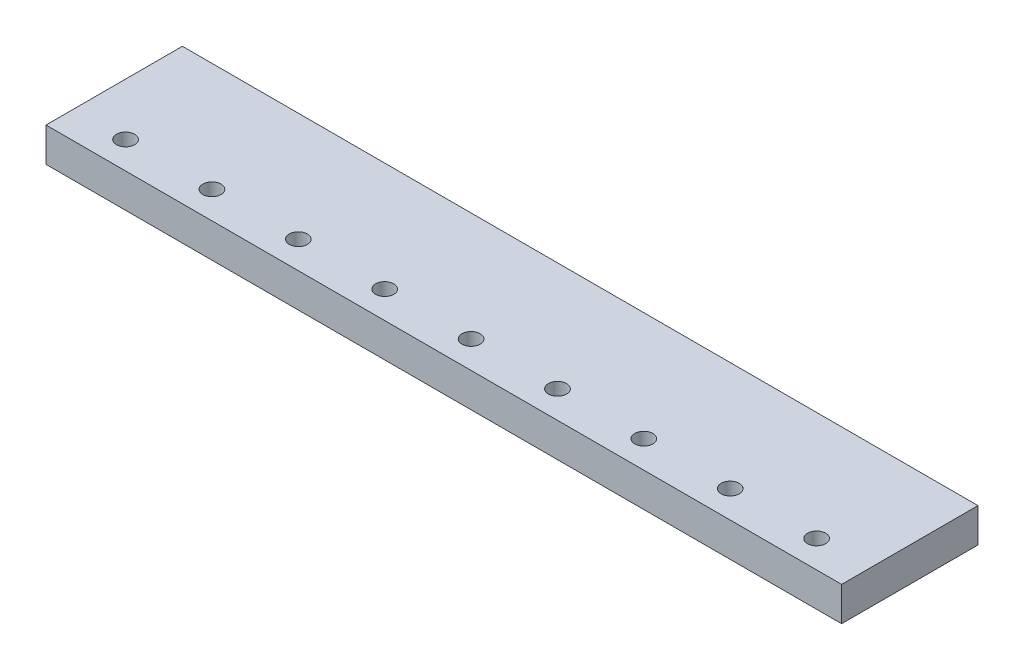
ISO-10303-21;
HEADER;
FILE_DESCRIPTION(('STEP AP214'),'2;1');
FILE_NAME('part.step','',(''),(''),'','','');
FILE_SCHEMA(('AUTOMOTIVE_DESIGN { 1 0 10303 214 1 1 1 1 }'));
ENDSEC;
DATA;
#1=APPLICATION_CONTEXT('core data for automotive mechanical design processes');
#2=APPLICATION_PROTOCOL_DEFINITION('international standard','automotive_design',2000,#1);
#3=PRODUCT_CONTEXT('',#1,'mechanical');
#4=PRODUCT('Part','Part','',(#3));
#5=PRODUCT_RELATED_PRODUCT_CATEGORY('part','',(#4));
#6=PRODUCT_DEFINITION_FORMATION('','',#4);
#7=PRODUCT_DEFINITION_CONTEXT('part definition',#1,'design');
#8=PRODUCT_DEFINITION('design','',#6,#7);
#9=PRODUCT_DEFINITION_SHAPE('','',#8);
#10=(LENGTH_UNIT() NAMED_UNIT(*) SI_UNIT(.MILLI.,.METRE.));
#11=(NAMED_UNIT(*) PLANE_ANGLE_UNIT() SI_UNIT($,.RADIAN.));
#12=(NAMED_UNIT(*) SI_UNIT($,.STERADIAN.) SOLID_ANGLE_UNIT());
#13=UNCERTAINTY_MEASURE_WITH_UNIT(LENGTH_MEASURE(1.E-05),#10,'distance_accuracy_value','');
#14=(GEOMETRIC_REPRESENTATION_CONTEXT(3) GLOBAL_UNCERTAINTY_ASSIGNED_CONTEXT((#13)) GLOBAL_UNIT_ASSIGNED_CONTEXT((#10,
#11,#12)) REPRESENTATION_CONTEXT('',''));
#15=CARTESIAN_POINT('',(0.,0.,0.));
#16=DIRECTION('',(0.,0.,1.));
#17=DIRECTION('',(1.,0.,0.));
#18=AXIS2_PLACEMENT_3D('',#15,#16,#17);
#19=CARTESIAN_POINT('',(0.,15.,0.));
#20=DIRECTION('',(1.,0.,0.));
#21=DIRECTION('',(0.,0.,-1.));
#22=AXIS2_PLACEMENT_3D('',#19,#20,#21);
#23=PLANE('',#22);
#24=DIRECTION('',(0.,0.,1.));
#25=VECTOR('',#24,1.);
#26=CARTESIAN_POINT('',(0.,0.,0.));
#27=LINE('',#26,#25);
#28=CARTESIAN_POINT('',(0.,0.,0.));
#29=VERTEX_POINT('',#28);
#30=CARTESIAN_POINT('',(0.,0.,60.));
#31=VERTEX_POINT('',#30);
#32=EDGE_CURVE('E110',#29,#31,#27,.T.);
#33=ORIENTED_EDGE('',*,*,#32,.T.);
#34=DIRECTION('',(0.,-1.,0.));
#35=VECTOR('',#34,1.);
#36=CARTESIAN_POINT('',(0.,15.,60.));
#37=LINE('',#36,#35);
#38=CARTESIAN_POINT('',(0.,15.,60.));
#39=VERTEX_POINT('',#38);
#40=EDGE_CURVE('E11',#39,#31,#37,.T.);
#41=ORIENTED_EDGE('',*,*,#40,.F.);
#42=DIRECTION('',(0.,0.,1.));
#43=VECTOR('',#42,1.);
#44=CARTESIAN_POINT('',(0.,15.,0.));
#45=LINE('',#44,#43);
#46=CARTESIAN_POINT('',(0.,15.,0.));
#47=VERTEX_POINT('',#46);
#48=EDGE_CURVE('E94',#47,#39,#45,.T.);
#49=ORIENTED_EDGE('',*,*,#48,.F.);
#50=DIRECTION('',(0.,-1.,0.));
#51=VECTOR('',#50,1.);
#52=CARTESIAN_POINT('',(0.,15.,0.));
#53=LINE('',#52,#51);
#54=EDGE_CURVE('E106',#47,#29,#53,.T.);
#55=ORIENTED_EDGE('',*,*,#54,.T.);
#56=EDGE_LOOP('',(#33,#41,#49,#55));
#57=FACE_BOUND('',#56,.T.);
#58=ADVANCED_FACE('F42',(#57),#23,.F.);
#59=CARTESIAN_POINT('',(0.,15.,60.));
#60=DIRECTION('',(0.,0.,-1.));
#61=DIRECTION('',(-1.,0.,0.));
#62=AXIS2_PLACEMENT_3D('',#59,#60,#61);
#63=PLANE('',#62);
#64=DIRECTION('',(1.,0.,0.));
#65=VECTOR('',#64,1.);
#66=CARTESIAN_POINT('',(0.,0.,60.));
#67=LINE('',#66,#65);
#68=CARTESIAN_POINT('',(350.,0.,60.));
#69=VERTEX_POINT('',#68);
#70=EDGE_CURVE('E99',#31,#69,#67,.T.);
#71=ORIENTED_EDGE('',*,*,#70,.T.);
#72=DIRECTION('',(0.,-1.,0.));
#73=VECTOR('',#72,1.);
#74=CARTESIAN_POINT('',(350.,15.,60.));
#75=LINE('',#74,#73);
#76=CARTESIAN_POINT('',(350.,15.,60.));
#77=VERTEX_POINT('',#76);
#78=EDGE_CURVE('E51',#77,#69,#75,.T.);
#79=ORIENTED_EDGE('',*,*,#78,.F.);
#80=DIRECTION('',(1.,0.,0.));
#81=VECTOR('',#80,1.);
#82=CARTESIAN_POINT('',(0.,15.,60.));
#83=LINE('',#82,#81);
#84=EDGE_CURVE('E89',#39,#77,#83,.T.);
#85=ORIENTED_EDGE('',*,*,#84,.F.);
#86=ORIENTED_EDGE('',*,*,#40,.T.);
#87=EDGE_LOOP('',(#71,#79,#85,#86));
#88=FACE_BOUND('',#87,.T.);
#89=ADVANCED_FACE('F98',(#88),#63,.F.);
#90=CARTESIAN_POINT('',(350.,15.,0.));
#91=DIRECTION('',(-1.,0.,0.));
#92=DIRECTION('',(0.,0.,1.));
#93=AXIS2_PLACEMENT_3D('',#90,#91,#92);
#94=PLANE('',#93);
#95=DIRECTION('',(0.,0.,-1.));
#96=VECTOR('',#95,1.);
#97=CARTESIAN_POINT('',(350.,0.,0.));
#98=LINE('',#97,#96);
#99=CARTESIAN_POINT('',(350.,0.,0.));
#100=VERTEX_POINT('',#99);
#101=EDGE_CURVE('E76',#69,#100,#98,.T.);
#102=ORIENTED_EDGE('',*,*,#101,.T.);
#103=DIRECTION('',(0.,-1.,0.));
#104=VECTOR('',#103,1.);
#105=CARTESIAN_POINT('',(350.,15.,0.));
#106=LINE('',#105,#104);
#107=CARTESIAN_POINT('',(350.,15.,0.));
#108=VERTEX_POINT('',#107);
#109=EDGE_CURVE('E101',#108,#100,#106,.T.);
#110=ORIENTED_EDGE('',*,*,#109,.F.);
#111=DIRECTION('',(0.,0.,-1.));
#112=VECTOR('',#111,1.);
#113=CARTESIAN_POINT('',(350.,15.,0.));
#114=LINE('',#113,#112);
#115=EDGE_CURVE('E92',#77,#108,#114,.T.);
#116=ORIENTED_EDGE('',*,*,#115,.F.);
#117=ORIENTED_EDGE('',*,*,#78,.T.);
#118=EDGE_LOOP('',(#102,#110,#116,#117));
#119=FACE_BOUND('',#118,.T.);
#120=ADVANCED_FACE('F102',(#119),#94,.F.);
#121=CARTESIAN_POINT('',(0.,15.,0.));
#122=DIRECTION('',(0.,0.,1.));
#123=DIRECTION('',(1.,0.,0.));
#124=AXIS2_PLACEMENT_3D('',#121,#122,#123);
#125=PLANE('',#124);
#126=DIRECTION('',(-1.,0.,0.));
#127=VECTOR('',#126,1.);
#128=CARTESIAN_POINT('',(0.,0.,0.));
#129=LINE('',#128,#127);
#130=EDGE_CURVE('E82',#100,#29,#129,.T.);
#131=ORIENTED_EDGE('',*,*,#130,.T.);
#132=ORIENTED_EDGE('',*,*,#54,.F.);
#133=DIRECTION('',(-1.,0.,0.));
#134=VECTOR('',#133,1.);
#135=CARTESIAN_POINT('',(0.,15.,0.));
#136=LINE('',#135,#134);
#137=EDGE_CURVE('E59',#108,#47,#136,.T.);
#138=ORIENTED_EDGE('',*,*,#137,.F.);
#139=ORIENTED_EDGE('',*,*,#109,.T.);
#140=EDGE_LOOP('',(#131,#132,#138,#139));
#141=FACE_BOUND('',#140,.T.);
#142=ADVANCED_FACE('F124',(#141),#125,.F.);
#143=CARTESIAN_POINT('',(0.,15.,0.));
#144=DIRECTION('',(0.,1.,0.));
#145=DIRECTION('',(0.,0.,1.));
#146=AXIS2_PLACEMENT_3D('',#143,#144,#145);
#147=PLANE('',#146);
#148=CARTESIAN_POINT('',(23.,15.,48.));
#149=DIRECTION('',(0.,1.,0.));
#150=DIRECTION('',(0.,0.,1.));
#151=AXIS2_PLACEMENT_3D('',#148,#149,#150);
#152=CIRCLE('',#151,4.);
#153=CARTESIAN_POINT('',(23.,15.,52.));
#154=VERTEX_POINT('',#153);
#155=EDGE_CURVE('E195',#154,#154,#152,.T.);
#156=ORIENTED_EDGE('',*,*,#155,.F.);
#157=EDGE_LOOP('',(#156));
#158=FACE_BOUND('',#157,.T.);
#159=CARTESIAN_POINT('',(61.,15.,48.));
#160=DIRECTION('',(0.,1.,0.));
#161=DIRECTION('',(0.,0.,1.));
#162=AXIS2_PLACEMENT_3D('',#159,#160,#161);
#163=CIRCLE('',#162,3.99999999999999);
#164=CARTESIAN_POINT('',(61.,15.,52.));
#165=VERTEX_POINT('',#164);
#166=EDGE_CURVE('E191',#165,#165,#163,.T.);
#167=ORIENTED_EDGE('',*,*,#166,.F.);
#168=EDGE_LOOP('',(#167));
#169=FACE_BOUND('',#168,.T.);
#170=CARTESIAN_POINT('',(99.,15.,48.));
#171=DIRECTION('',(0.,1.,0.));
#172=DIRECTION('',(0.,0.,1.));
#173=AXIS2_PLACEMENT_3D('',#170,#171,#172);
#174=CIRCLE('',#173,3.99999999999999);
#175=CARTESIAN_POINT('',(99.,15.,52.));
#176=VERTEX_POINT('',#175);
#177=EDGE_CURVE('E183',#176,#176,#174,.T.);
#178=ORIENTED_EDGE('',*,*,#177,.F.);
#179=EDGE_LOOP('',(#178));
#180=FACE_BOUND('',#179,.T.);
#181=CARTESIAN_POINT('',(137.,15.,48.));
#182=DIRECTION('',(0.,1.,0.));
#183=DIRECTION('',(0.,0.,1.));
#184=AXIS2_PLACEMENT_3D('',#181,#182,#183);
#185=CIRCLE('',#184,4.00000000000002);
#186=CARTESIAN_POINT('',(137.,15.,52.));
#187=VERTEX_POINT('',#186);
#188=EDGE_CURVE('E175',#187,#187,#185,.T.);
#189=ORIENTED_EDGE('',*,*,#188,.F.);
#190=EDGE_LOOP('',(#189));
#191=FACE_BOUND('',#190,.T.);
#192=CARTESIAN_POINT('',(175.,15.,48.));
#193=DIRECTION('',(0.,1.,0.));
#194=DIRECTION('',(0.,0.,1.));
#195=AXIS2_PLACEMENT_3D('',#192,#193,#194);
#196=CIRCLE('',#195,3.99999999999999);
#197=CARTESIAN_POINT('',(175.,15.,52.));
#198=VERTEX_POINT('',#197);
#199=EDGE_CURVE('E167',#198,#198,#196,.T.);
#200=ORIENTED_EDGE('',*,*,#199,.F.);
#201=EDGE_LOOP('',(#200));
#202=FACE_BOUND('',#201,.T.);
#203=CARTESIAN_POINT('',(213.,15.,48.));
#204=DIRECTION('',(0.,1.,0.));
#205=DIRECTION('',(0.,0.,1.));
#206=AXIS2_PLACEMENT_3D('',#203,#204,#205);
#207=CIRCLE('',#206,4.00000000000002);
#208=CARTESIAN_POINT('',(213.,15.,52.));
#209=VERTEX_POINT('',#208);
#210=EDGE_CURVE('E159',#209,#209,#207,.T.);
#211=ORIENTED_EDGE('',*,*,#210,.F.);
#212=EDGE_LOOP('',(#211));
#213=FACE_BOUND('',#212,.T.);
#214=CARTESIAN_POINT('',(251.,15.,48.));
#215=DIRECTION('',(0.,1.,0.));
#216=DIRECTION('',(0.,0.,1.));
#217=AXIS2_PLACEMENT_3D('',#214,#215,#216);
#218=CIRCLE('',#217,3.99999999999999);
#219=CARTESIAN_POINT('',(251.,15.,52.));
#220=VERTEX_POINT('',#219);
#221=EDGE_CURVE('E151',#220,#220,#218,.T.);
#222=ORIENTED_EDGE('',*,*,#221,.F.);
#223=EDGE_LOOP('',(#222));
#224=FACE_BOUND('',#223,.T.);
#225=CARTESIAN_POINT('',(289.,15.,48.));
#226=DIRECTION('',(0.,1.,0.));
#227=DIRECTION('',(0.,0.,1.));
#228=AXIS2_PLACEMENT_3D('',#225,#226,#227);
#229=CIRCLE('',#228,3.99999999999999);
#230=CARTESIAN_POINT('',(289.,15.,52.));
#231=VERTEX_POINT('',#230);
#232=EDGE_CURVE('E143',#231,#231,#229,.T.);
#233=ORIENTED_EDGE('',*,*,#232,.F.);
#234=EDGE_LOOP('',(#233));
#235=FACE_BOUND('',#234,.T.);
#236=CARTESIAN_POINT('',(327.,15.,48.));
#237=DIRECTION('',(0.,1.,0.));
#238=DIRECTION('',(0.,0.,1.));
#239=AXIS2_PLACEMENT_3D('',#236,#237,#238);
#240=CIRCLE('',#239,3.99999999999999);
#241=CARTESIAN_POINT('',(327.,15.,52.));
#242=VERTEX_POINT('',#241);
#243=EDGE_CURVE('E135',#242,#242,#240,.T.);
#244=ORIENTED_EDGE('',*,*,#243,.F.);
#245=EDGE_LOOP('',(#244));
#246=FACE_BOUND('',#245,.T.);
#247=ORIENTED_EDGE('',*,*,#48,.T.);
#248=ORIENTED_EDGE('',*,*,#84,.T.);
#249=ORIENTED_EDGE('',*,*,#115,.T.);
#250=ORIENTED_EDGE('',*,*,#137,.T.);
#251=EDGE_LOOP('',(#247,#248,#249,#250));
#252=FACE_BOUND('',#251,.T.);
#253=ADVANCED_FACE('F90',(#158,#169,#180,#191,#202,#213,#224,#235,#246,#252),#147,.T.);
#254=CARTESIAN_POINT('',(0.,0.,0.));
#255=DIRECTION('',(0.,1.,0.));
#256=DIRECTION('',(0.,0.,1.));
#257=AXIS2_PLACEMENT_3D('',#254,#255,#256);
#258=PLANE('',#257);
#259=CARTESIAN_POINT('',(23.,0.,48.));
#260=DIRECTION('',(0.,1.,0.));
#261=DIRECTION('',(0.,0.,1.));
#262=AXIS2_PLACEMENT_3D('',#259,#260,#261);
#263=CIRCLE('',#262,4.);
#264=CARTESIAN_POINT('',(23.,0.,52.));
#265=VERTEX_POINT('',#264);
#266=EDGE_CURVE('E114',#265,#265,#263,.T.);
#267=ORIENTED_EDGE('',*,*,#266,.T.);
#268=EDGE_LOOP('',(#267));
#269=FACE_BOUND('',#268,.T.);
#270=CARTESIAN_POINT('',(61.,0.,48.));
#271=DIRECTION('',(0.,1.,0.));
#272=DIRECTION('',(0.,0.,1.));
#273=AXIS2_PLACEMENT_3D('',#270,#271,#272);
#274=CIRCLE('',#273,3.99999999999999);
#275=CARTESIAN_POINT('',(61.,0.,52.));
#276=VERTEX_POINT('',#275);
#277=EDGE_CURVE('E187',#276,#276,#274,.T.);
#278=ORIENTED_EDGE('',*,*,#277,.T.);
#279=EDGE_LOOP('',(#278));
#280=FACE_BOUND('',#279,.T.);
#281=CARTESIAN_POINT('',(99.,0.,48.));
#282=DIRECTION('',(0.,1.,0.));
#283=DIRECTION('',(0.,0.,1.));
#284=AXIS2_PLACEMENT_3D('',#281,#282,#283);
#285=CIRCLE('',#284,3.99999999999999);
#286=CARTESIAN_POINT('',(99.,0.,52.));
#287=VERTEX_POINT('',#286);
#288=EDGE_CURVE('E179',#287,#287,#285,.T.);
#289=ORIENTED_EDGE('',*,*,#288,.T.);
#290=EDGE_LOOP('',(#289));
#291=FACE_BOUND('',#290,.T.);
#292=CARTESIAN_POINT('',(137.,0.,48.));
#293=DIRECTION('',(0.,1.,0.));
#294=DIRECTION('',(0.,0.,1.));
#295=AXIS2_PLACEMENT_3D('',#292,#293,#294);
#296=CIRCLE('',#295,4.00000000000002);
#297=CARTESIAN_POINT('',(137.,0.,52.));
#298=VERTEX_POINT('',#297);
#299=EDGE_CURVE('E171',#298,#298,#296,.T.);
#300=ORIENTED_EDGE('',*,*,#299,.T.);
#301=EDGE_LOOP('',(#300));
#302=FACE_BOUND('',#301,.T.);
#303=CARTESIAN_POINT('',(175.,0.,48.));
#304=DIRECTION('',(0.,1.,0.));
#305=DIRECTION('',(0.,0.,1.));
#306=AXIS2_PLACEMENT_3D('',#303,#304,#305);
#307=CIRCLE('',#306,3.99999999999999);
#308=CARTESIAN_POINT('',(175.,0.,52.));
#309=VERTEX_POINT('',#308);
#310=EDGE_CURVE('E163',#309,#309,#307,.T.);
#311=ORIENTED_EDGE('',*,*,#310,.T.);
#312=EDGE_LOOP('',(#311));
#313=FACE_BOUND('',#312,.T.);
#314=CARTESIAN_POINT('',(213.,0.,48.));
#315=DIRECTION('',(0.,1.,0.));
#316=DIRECTION('',(0.,0.,1.));
#317=AXIS2_PLACEMENT_3D('',#314,#315,#316);
#318=CIRCLE('',#317,4.00000000000002);
#319=CARTESIAN_POINT('',(213.,0.,52.));
#320=VERTEX_POINT('',#319);
#321=EDGE_CURVE('E155',#320,#320,#318,.T.);
#322=ORIENTED_EDGE('',*,*,#321,.T.);
#323=EDGE_LOOP('',(#322));
#324=FACE_BOUND('',#323,.T.);
#325=CARTESIAN_POINT('',(251.,0.,48.));
#326=DIRECTION('',(0.,1.,0.));
#327=DIRECTION('',(0.,0.,1.));
#328=AXIS2_PLACEMENT_3D('',#325,#326,#327);
#329=CIRCLE('',#328,3.99999999999999);
#330=CARTESIAN_POINT('',(251.,0.,52.));
#331=VERTEX_POINT('',#330);
#332=EDGE_CURVE('E147',#331,#331,#329,.T.);
#333=ORIENTED_EDGE('',*,*,#332,.T.);
#334=EDGE_LOOP('',(#333));
#335=FACE_BOUND('',#334,.T.);
#336=CARTESIAN_POINT('',(289.,0.,48.));
#337=DIRECTION('',(0.,1.,0.));
#338=DIRECTION('',(0.,0.,1.));
#339=AXIS2_PLACEMENT_3D('',#336,#337,#338);
#340=CIRCLE('',#339,3.99999999999999);
#341=CARTESIAN_POINT('',(289.,0.,52.));
#342=VERTEX_POINT('',#341);
#343=EDGE_CURVE('E139',#342,#342,#340,.T.);
#344=ORIENTED_EDGE('',*,*,#343,.T.);
#345=EDGE_LOOP('',(#344));
#346=FACE_BOUND('',#345,.T.);
#347=CARTESIAN_POINT('',(327.,0.,48.));
#348=DIRECTION('',(0.,1.,0.));
#349=DIRECTION('',(0.,0.,1.));
#350=AXIS2_PLACEMENT_3D('',#347,#348,#349);
#351=CIRCLE('',#350,3.99999999999999);
#352=CARTESIAN_POINT('',(327.,0.,52.));
#353=VERTEX_POINT('',#352);
#354=EDGE_CURVE('E131',#353,#353,#351,.T.);
#355=ORIENTED_EDGE('',*,*,#354,.T.);
#356=EDGE_LOOP('',(#355));
#357=FACE_BOUND('',#356,.T.);
#358=ORIENTED_EDGE('',*,*,#32,.F.);
#359=ORIENTED_EDGE('',*,*,#130,.F.);
#360=ORIENTED_EDGE('',*,*,#101,.F.);
#361=ORIENTED_EDGE('',*,*,#70,.F.);
#362=EDGE_LOOP('',(#358,#359,#360,#361));
#363=FACE_BOUND('',#362,.T.);
#364=ADVANCED_FACE('F127',(#269,#280,#291,#302,#313,#324,#335,#346,#357,#363),#258,.F.);
#365=CARTESIAN_POINT('',(327.,0.,48.));
#366=DIRECTION('',(0.,1.,0.));
#367=DIRECTION('',(0.,0.,1.));
#368=AXIS2_PLACEMENT_3D('',#365,#366,#367);
#369=CYLINDRICAL_SURFACE('',#368,3.99999999999999);
#370=ORIENTED_EDGE('',*,*,#354,.F.);
#371=EDGE_LOOP('',(#370));
#372=FACE_BOUND('',#371,.T.);
#373=ORIENTED_EDGE('',*,*,#243,.T.);
#374=EDGE_LOOP('',(#373));
#375=FACE_BOUND('',#374,.T.);
#376=ADVANCED_FACE('F231',(#372,#375),#369,.F.);
#377=CARTESIAN_POINT('',(289.,0.,48.));
#378=DIRECTION('',(0.,1.,0.));
#379=DIRECTION('',(0.,0.,1.));
#380=AXIS2_PLACEMENT_3D('',#377,#378,#379);
#381=CYLINDRICAL_SURFACE('',#380,3.99999999999999);
#382=ORIENTED_EDGE('',*,*,#343,.F.);
#383=EDGE_LOOP('',(#382));
#384=FACE_BOUND('',#383,.T.);
#385=ORIENTED_EDGE('',*,*,#232,.T.);
#386=EDGE_LOOP('',(#385));
#387=FACE_BOUND('',#386,.T.);
#388=ADVANCED_FACE('F233',(#384,#387),#381,.F.);
#389=CARTESIAN_POINT('',(251.,0.,48.));
#390=DIRECTION('',(0.,1.,0.));
#391=DIRECTION('',(0.,0.,1.));
#392=AXIS2_PLACEMENT_3D('',#389,#390,#391);
#393=CYLINDRICAL_SURFACE('',#392,3.99999999999999);
#394=ORIENTED_EDGE('',*,*,#332,.F.);
#395=EDGE_LOOP('',(#394));
#396=FACE_BOUND('',#395,.T.);
#397=ORIENTED_EDGE('',*,*,#221,.T.);
#398=EDGE_LOOP('',(#397));
#399=FACE_BOUND('',#398,.T.);
#400=ADVANCED_FACE('F240',(#396,#399),#393,.F.);
#401=CARTESIAN_POINT('',(213.,0.,48.));
#402=DIRECTION('',(0.,1.,0.));
#403=DIRECTION('',(0.,0.,1.));
#404=AXIS2_PLACEMENT_3D('',#401,#402,#403);
#405=CYLINDRICAL_SURFACE('',#404,4.00000000000002);
#406=ORIENTED_EDGE('',*,*,#321,.F.);
#407=EDGE_LOOP('',(#406));
#408=FACE_BOUND('',#407,.T.);
#409=ORIENTED_EDGE('',*,*,#210,.T.);
#410=EDGE_LOOP('',(#409));
#411=FACE_BOUND('',#410,.T.);
#412=ADVANCED_FACE('F289',(#408,#411),#405,.F.);
#413=CARTESIAN_POINT('',(175.,0.,48.));
#414=DIRECTION('',(0.,1.,0.));
#415=DIRECTION('',(0.,0.,1.));
#416=AXIS2_PLACEMENT_3D('',#413,#414,#415);
#417=CYLINDRICAL_SURFACE('',#416,3.99999999999999);
#418=ORIENTED_EDGE('',*,*,#310,.F.);
#419=EDGE_LOOP('',(#418));
#420=FACE_BOUND('',#419,.T.);
#421=ORIENTED_EDGE('',*,*,#199,.T.);
#422=EDGE_LOOP('',(#421));
#423=FACE_BOUND('',#422,.T.);
#424=ADVANCED_FACE('F300',(#420,#423),#417,.F.);
#425=CARTESIAN_POINT('',(137.,0.,48.));
#426=DIRECTION('',(0.,1.,0.));
#427=DIRECTION('',(0.,0.,1.));
#428=AXIS2_PLACEMENT_3D('',#425,#426,#427);
#429=CYLINDRICAL_SURFACE('',#428,4.00000000000002);
#430=ORIENTED_EDGE('',*,*,#299,.F.);
#431=EDGE_LOOP('',(#430));
#432=FACE_BOUND('',#431,.T.);
#433=ORIENTED_EDGE('',*,*,#188,.T.);
#434=EDGE_LOOP('',(#433));
#435=FACE_BOUND('',#434,.T.);
#436=ADVANCED_FACE('F311',(#432,#435),#429,.F.);
#437=CARTESIAN_POINT('',(99.,0.,48.));
#438=DIRECTION('',(0.,1.,0.));
#439=DIRECTION('',(0.,0.,1.));
#440=AXIS2_PLACEMENT_3D('',#437,#438,#439);
#441=CYLINDRICAL_SURFACE('',#440,3.99999999999999);
#442=ORIENTED_EDGE('',*,*,#288,.F.);
#443=EDGE_LOOP('',(#442));
#444=FACE_BOUND('',#443,.T.);
#445=ORIENTED_EDGE('',*,*,#177,.T.);
#446=EDGE_LOOP('',(#445));
#447=FACE_BOUND('',#446,.T.);
#448=ADVANCED_FACE('F322',(#444,#447),#441,.F.);
#449=CARTESIAN_POINT('',(61.,0.,48.));
#450=DIRECTION('',(0.,1.,0.));
#451=DIRECTION('',(0.,0.,1.));
#452=AXIS2_PLACEMENT_3D('',#449,#450,#451);
#453=CYLINDRICAL_SURFACE('',#452,3.99999999999999);
#454=ORIENTED_EDGE('',*,*,#277,.F.);
#455=EDGE_LOOP('',(#454));
#456=FACE_BOUND('',#455,.T.);
#457=ORIENTED_EDGE('',*,*,#166,.T.);
#458=EDGE_LOOP('',(#457));
#459=FACE_BOUND('',#458,.T.);
#460=ADVANCED_FACE('F208',(#456,#459),#453,.F.);
#461=CARTESIAN_POINT('',(23.,0.,48.));
#462=DIRECTION('',(0.,1.,0.));
#463=DIRECTION('',(0.,0.,1.));
#464=AXIS2_PLACEMENT_3D('',#461,#462,#463);
#465=CYLINDRICAL_SURFACE('',#464,4.);
#466=ORIENTED_EDGE('',*,*,#266,.F.);
#467=EDGE_LOOP('',(#466));
#468=FACE_BOUND('',#467,.T.);
#469=ORIENTED_EDGE('',*,*,#155,.T.);
#470=EDGE_LOOP('',(#469));
#471=FACE_BOUND('',#470,.T.);
#472=ADVANCED_FACE('F205',(#468,#471),#465,.F.);
#473=CLOSED_SHELL('',(#58,#89,#120,#142,#253,#364,#376,#388,#400,#412,#424,#436,#448,#460,#472));
#474=MANIFOLD_SOLID_BREP('B2',#473);
#475=ADVANCED_BREP_SHAPE_REPRESENTATION('',(#18,#474),#14);
#476=SHAPE_DEFINITION_REPRESENTATION(#9,#475);
ENDSEC;
END-ISO-10303-21;
